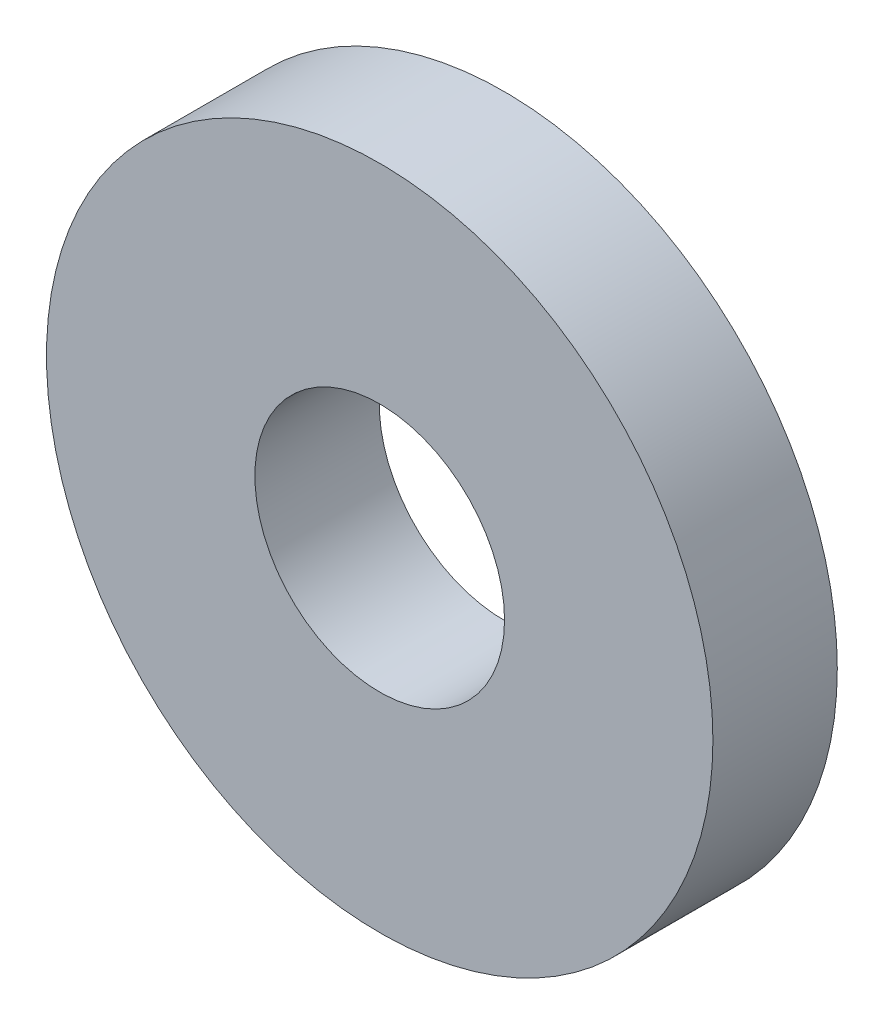
ISO-10303-21;
HEADER;
FILE_DESCRIPTION(('STEP AP214'),'2;1');
FILE_NAME('part.step','',(''),(''),'','','');
FILE_SCHEMA(('AUTOMOTIVE_DESIGN { 1 0 10303 214 1 1 1 1 }'));
ENDSEC;
DATA;
#1=APPLICATION_CONTEXT('core data for automotive mechanical design processes');
#2=APPLICATION_PROTOCOL_DEFINITION('international standard','automotive_design',2000,#1);
#3=PRODUCT_CONTEXT('',#1,'mechanical');
#4=PRODUCT('Part','Part','',(#3));
#5=PRODUCT_RELATED_PRODUCT_CATEGORY('part','',(#4));
#6=PRODUCT_DEFINITION_FORMATION('','',#4);
#7=PRODUCT_DEFINITION_CONTEXT('part definition',#1,'design');
#8=PRODUCT_DEFINITION('design','',#6,#7);
#9=PRODUCT_DEFINITION_SHAPE('','',#8);
#10=(LENGTH_UNIT() NAMED_UNIT(*) SI_UNIT(.MILLI.,.METRE.));
#11=(NAMED_UNIT(*) PLANE_ANGLE_UNIT() SI_UNIT($,.RADIAN.));
#12=(NAMED_UNIT(*) SI_UNIT($,.STERADIAN.) SOLID_ANGLE_UNIT());
#13=UNCERTAINTY_MEASURE_WITH_UNIT(LENGTH_MEASURE(1.E-05),#10,'distance_accuracy_value','');
#14=(GEOMETRIC_REPRESENTATION_CONTEXT(3) GLOBAL_UNCERTAINTY_ASSIGNED_CONTEXT((#13)) GLOBAL_UNIT_ASSIGNED_CONTEXT((#10,
#11,#12)) REPRESENTATION_CONTEXT('',''));
#15=CARTESIAN_POINT('',(0.,0.,0.));
#16=DIRECTION('',(0.,0.,1.));
#17=DIRECTION('',(1.,0.,0.));
#18=AXIS2_PLACEMENT_3D('',#15,#16,#17);
#19=CARTESIAN_POINT('',(0.,0.,1.778));
#20=DIRECTION('',(0.,0.,1.));
#21=DIRECTION('',(1.,0.,0.));
#22=AXIS2_PLACEMENT_3D('',#19,#20,#21);
#23=PLANE('',#22);
#24=CARTESIAN_POINT('',(0.,0.,1.778));
#25=DIRECTION('',(0.,0.,1.));
#26=DIRECTION('',(1.,0.,0.));
#27=AXIS2_PLACEMENT_3D('',#24,#25,#26);
#28=CIRCLE('',#27,9.525);
#29=CARTESIAN_POINT('',(9.525,0.,1.778));
#30=VERTEX_POINT('',#29);
#31=EDGE_CURVE('E10',#30,#30,#28,.T.);
#32=ORIENTED_EDGE('',*,*,#31,.T.);
#33=EDGE_LOOP('',(#32));
#34=FACE_BOUND('',#33,.T.);
#35=CARTESIAN_POINT('',(0.,0.,1.778));
#36=DIRECTION('',(0.,0.,1.));
#37=DIRECTION('',(1.,0.,0.));
#38=AXIS2_PLACEMENT_3D('',#35,#36,#37);
#39=CIRCLE('',#38,3.5687);
#40=CARTESIAN_POINT('',(3.5687,0.,1.778));
#41=VERTEX_POINT('',#40);
#42=EDGE_CURVE('E46',#41,#41,#39,.T.);
#43=ORIENTED_EDGE('',*,*,#42,.F.);
#44=EDGE_LOOP('',(#43));
#45=FACE_BOUND('',#44,.T.);
#46=ADVANCED_FACE('F34',(#34,#45),#23,.T.);
#47=CARTESIAN_POINT('',(0.,0.,-1.778));
#48=DIRECTION('',(0.,0.,1.));
#49=DIRECTION('',(1.,0.,0.));
#50=AXIS2_PLACEMENT_3D('',#47,#48,#49);
#51=PLANE('',#50);
#52=CARTESIAN_POINT('',(0.,0.,-1.778));
#53=DIRECTION('',(0.,0.,1.));
#54=DIRECTION('',(1.,0.,0.));
#55=AXIS2_PLACEMENT_3D('',#52,#53,#54);
#56=CIRCLE('',#55,9.525);
#57=CARTESIAN_POINT('',(9.525,0.,-1.778));
#58=VERTEX_POINT('',#57);
#59=EDGE_CURVE('E39',#58,#58,#56,.T.);
#60=ORIENTED_EDGE('',*,*,#59,.F.);
#61=EDGE_LOOP('',(#60));
#62=FACE_BOUND('',#61,.T.);
#63=CARTESIAN_POINT('',(0.,0.,-1.778));
#64=DIRECTION('',(0.,0.,1.));
#65=DIRECTION('',(1.,0.,0.));
#66=AXIS2_PLACEMENT_3D('',#63,#64,#65);
#67=CIRCLE('',#66,3.5687);
#68=CARTESIAN_POINT('',(3.5687,0.,-1.778));
#69=VERTEX_POINT('',#68);
#70=EDGE_CURVE('E48',#69,#69,#67,.T.);
#71=ORIENTED_EDGE('',*,*,#70,.T.);
#72=EDGE_LOOP('',(#71));
#73=FACE_BOUND('',#72,.T.);
#74=ADVANCED_FACE('F59',(#62,#73),#51,.F.);
#75=CARTESIAN_POINT('',(0.,0.,1.778));
#76=DIRECTION('',(0.,0.,-1.));
#77=DIRECTION('',(-1.,0.,0.));
#78=AXIS2_PLACEMENT_3D('',#75,#76,#77);
#79=CYLINDRICAL_SURFACE('',#78,9.525);
#80=ORIENTED_EDGE('',*,*,#31,.F.);
#81=EDGE_LOOP('',(#80));
#82=FACE_BOUND('',#81,.T.);
#83=ORIENTED_EDGE('',*,*,#59,.T.);
#84=EDGE_LOOP('',(#83));
#85=FACE_BOUND('',#84,.T.);
#86=ADVANCED_FACE('F40',(#82,#85),#79,.T.);
#87=CARTESIAN_POINT('',(0.,0.,1.778));
#88=DIRECTION('',(0.,0.,-1.));
#89=DIRECTION('',(-1.,0.,0.));
#90=AXIS2_PLACEMENT_3D('',#87,#88,#89);
#91=CYLINDRICAL_SURFACE('',#90,3.5687);
#92=ORIENTED_EDGE('',*,*,#42,.T.);
#93=EDGE_LOOP('',(#92));
#94=FACE_BOUND('',#93,.T.);
#95=ORIENTED_EDGE('',*,*,#70,.F.);
#96=EDGE_LOOP('',(#95));
#97=FACE_BOUND('',#96,.T.);
#98=ADVANCED_FACE('F53',(#94,#97),#91,.F.);
#99=CLOSED_SHELL('',(#46,#74,#86,#98));
#100=MANIFOLD_SOLID_BREP('B2',#99);
#101=ADVANCED_BREP_SHAPE_REPRESENTATION('',(#18,#100),#14);
#102=SHAPE_DEFINITION_REPRESENTATION(#9,#101);
ENDSEC;
END-ISO-10303-21;
